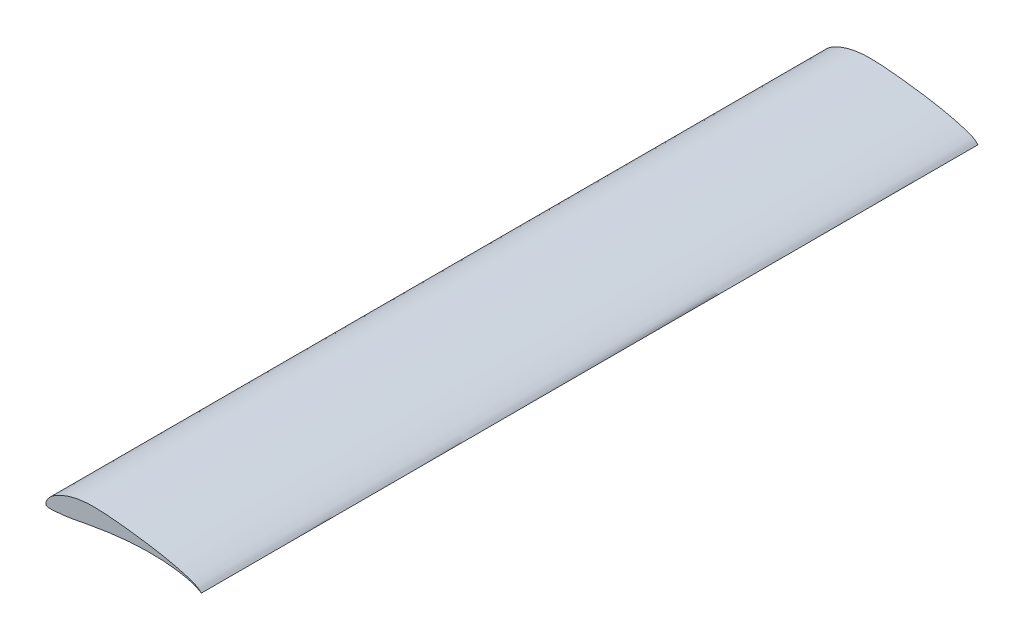
ISO-10303-21;
HEADER;
FILE_DESCRIPTION(('STEP AP214'),'2;1');
FILE_NAME('part.step','',(''),(''),'','','');
FILE_SCHEMA(('AUTOMOTIVE_DESIGN { 1 0 10303 214 1 1 1 1 }'));
ENDSEC;
DATA;
#1=APPLICATION_CONTEXT('core data for automotive mechanical design processes');
#2=APPLICATION_PROTOCOL_DEFINITION('international standard','automotive_design',2000,#1);
#3=PRODUCT_CONTEXT('',#1,'mechanical');
#4=PRODUCT('Part','Part','',(#3));
#5=PRODUCT_RELATED_PRODUCT_CATEGORY('part','',(#4));
#6=PRODUCT_DEFINITION_FORMATION('','',#4);
#7=PRODUCT_DEFINITION_CONTEXT('part definition',#1,'design');
#8=PRODUCT_DEFINITION('design','',#6,#7);
#9=PRODUCT_DEFINITION_SHAPE('','',#8);
#10=(LENGTH_UNIT() NAMED_UNIT(*) SI_UNIT(.MILLI.,.METRE.));
#11=(NAMED_UNIT(*) PLANE_ANGLE_UNIT() SI_UNIT($,.RADIAN.));
#12=(NAMED_UNIT(*) SI_UNIT($,.STERADIAN.) SOLID_ANGLE_UNIT());
#13=UNCERTAINTY_MEASURE_WITH_UNIT(LENGTH_MEASURE(1.E-05),#10,'distance_accuracy_value','');
#14=(GEOMETRIC_REPRESENTATION_CONTEXT(3) GLOBAL_UNCERTAINTY_ASSIGNED_CONTEXT((#13)) GLOBAL_UNIT_ASSIGNED_CONTEXT((#10,
#11,#12)) REPRESENTATION_CONTEXT('',''));
#15=CARTESIAN_POINT('',(0.,0.,0.));
#16=DIRECTION('',(0.,0.,1.));
#17=DIRECTION('',(1.,0.,0.));
#18=AXIS2_PLACEMENT_3D('',#15,#16,#17);
#19=CARTESIAN_POINT('',(190.5,0.,952.5));
#20=CARTESIAN_POINT('',(190.501140449589,0.0048495957089294,952.5));
#21=CARTESIAN_POINT('',(189.874896952706,0.471443657705428,952.5));
#22=CARTESIAN_POINT('',(189.345268773799,0.991100652656051,952.5));
#23=CARTESIAN_POINT('',(188.169280273613,2.0765066228,952.5));
#24=CARTESIAN_POINT('',(186.781888795589,3.23117102655988,952.5));
#25=CARTESIAN_POINT('',(184.88405642052,4.39520121830042,952.5));
#26=CARTESIAN_POINT('',(182.524087437213,5.52327806805247,952.5));
#27=CARTESIAN_POINT('',(179.675049468122,6.70056289760328,952.5));
#28=CARTESIAN_POINT('',(176.341285283456,7.91066310604408,952.5));
#29=CARTESIAN_POINT('',(172.538347888506,9.14503023382941,952.5));
#30=CARTESIAN_POINT('',(168.285979658223,10.3929470321648,952.5));
#31=CARTESIAN_POINT('',(163.607992669297,11.6485563790145,952.5));
#32=CARTESIAN_POINT('',(158.530216744362,12.9003293823792,952.5));
#33=CARTESIAN_POINT('',(153.081764098004,14.1392045174724,952.5));
#34=CARTESIAN_POINT('',(147.295108851122,15.3574437784953,952.5));
#35=CARTESIAN_POINT('',(141.2055870047,16.5487844846756,952.5));
#36=CARTESIAN_POINT('',(134.848789079749,17.6985664854184,952.5));
#37=CARTESIAN_POINT('',(128.264745027978,18.8051470715732,952.5));
#38=CARTESIAN_POINT('',(121.49139921987,19.8542768906775,952.5));
#39=CARTESIAN_POINT('',(114.572555058156,20.8480045739809,952.5));
#40=CARTESIAN_POINT('',(107.552554075075,21.778455325284,952.5));
#41=CARTESIAN_POINT('',(100.482242170247,22.642651753132,952.5));
#42=CARTESIAN_POINT('',(93.418141124453,23.4467128367726,952.5));
#43=CARTESIAN_POINT('',(86.4187311731453,24.1703500382271,952.5));
#44=CARTESIAN_POINT('',(79.5410354374557,24.8000196646809,952.5));
#45=CARTESIAN_POINT('',(72.8334260080536,25.300280470554,952.5));
#46=CARTESIAN_POINT('',(66.3342192129176,25.6443956990042,952.5));
#47=CARTESIAN_POINT('',(60.0795722638279,25.793000688111,952.5));
#48=CARTESIAN_POINT('',(54.1015268277811,25.7771826579008,952.5));
#49=CARTESIAN_POINT('',(48.4112342720622,25.484480074596,952.5));
#50=CARTESIAN_POINT('',(43.0064903328941,24.8913314752254,952.5));
#51=CARTESIAN_POINT('',(37.8652935068441,24.0526105595702,952.5));
#52=CARTESIAN_POINT('',(32.9864029615348,22.9660550175243,952.5));
#53=CARTESIAN_POINT('',(28.374831045459,21.6919170778944,952.5));
#54=CARTESIAN_POINT('',(24.0500898891839,20.2527636743946,952.5));
#55=CARTESIAN_POINT('',(20.0305722180258,18.6822494611587,952.5));
#56=CARTESIAN_POINT('',(16.3412557855691,16.9887886763823,952.5));
#57=CARTESIAN_POINT('',(12.993972054327,15.2067634457409,952.5));
#58=CARTESIAN_POINT('',(10.0069313476093,13.3564388384793,952.5));
#59=CARTESIAN_POINT('',(7.39886570646804,11.4628883578561,952.5));
#60=CARTESIAN_POINT('',(5.17085121626949,9.56624809789992,952.5));
#61=CARTESIAN_POINT('',(3.35519800172101,7.64581480485506,952.5));
#62=CARTESIAN_POINT('',(1.9605447426959,5.71821947228835,952.5));
#63=CARTESIAN_POINT('',(0.930349505974305,3.84292592213187,952.5));
#64=CARTESIAN_POINT('',(0.270103382985031,2.06242354471595,952.5));
#65=CARTESIAN_POINT('',(-0.0445039266248067,0.419020388939446,952.5));
#66=CARTESIAN_POINT('',(0.01622379836538,-0.970909150629432,952.5));
#67=CARTESIAN_POINT('',(0.37406657775095,-2.24569850572259,952.5));
#68=CARTESIAN_POINT('',(1.70422548850311,-2.87851328047877,952.5));
#69=CARTESIAN_POINT('',(3.49264160988838,-2.9672952003997,952.5));
#70=CARTESIAN_POINT('',(5.9391881962373,-3.0533429863419,952.5));
#71=CARTESIAN_POINT('',(9.01589319503747,-2.92066900631582,952.5));
#72=CARTESIAN_POINT('',(12.6879837622343,-2.67685466301448,952.5));
#73=CARTESIAN_POINT('',(16.9145933629107,-2.28631695509474,952.5));
#74=CARTESIAN_POINT('',(21.6524720680806,-1.75790264475743,952.5));
#75=CARTESIAN_POINT('',(26.8785167362475,-1.08027291413276,952.5));
#76=CARTESIAN_POINT('',(32.5901734764809,-0.133184537470371,952.5));
#77=CARTESIAN_POINT('',(38.8152518554393,1.05444893486645,952.5));
#78=CARTESIAN_POINT('',(45.5848730747557,2.34697313689791,952.5));
#79=CARTESIAN_POINT('',(52.8659477782625,3.7116933895576,952.5));
#80=CARTESIAN_POINT('',(60.6127431591076,5.09196451135422,952.5));
#81=CARTESIAN_POINT('',(68.7683664747485,6.43598654583158,952.5));
#82=CARTESIAN_POINT('',(77.2695458328151,7.69887908019521,952.5));
#83=CARTESIAN_POINT('',(86.0430184615308,8.83431467366265,952.5));
#84=CARTESIAN_POINT('',(95.0098869783615,9.8092321815838,952.5));
#85=CARTESIAN_POINT('',(104.085447690544,10.5798643290774,952.5));
#86=CARTESIAN_POINT('',(113.178625109717,11.1261474986054,952.5));
#87=CARTESIAN_POINT('',(122.194418873725,11.426469615573,952.5));
#88=CARTESIAN_POINT('',(131.035023441319,11.464402450769,952.5));
#89=CARTESIAN_POINT('',(139.601808022583,11.2373686451341,952.5));
#90=CARTESIAN_POINT('',(147.796677859016,10.7506831042987,952.5));
#91=CARTESIAN_POINT('',(155.52109080117,10.0106253823236,952.5));
#92=CARTESIAN_POINT('',(162.683083088023,9.04560251163728,952.5));
#93=CARTESIAN_POINT('',(169.189407873441,7.88361581848485,952.5));
#94=CARTESIAN_POINT('',(174.963781380328,6.56358167721512,952.5));
#95=CARTESIAN_POINT('',(179.899784557374,5.15108633861004,952.5));
#96=CARTESIAN_POINT('',(183.93939411068,3.64354937207193,952.5));
#97=CARTESIAN_POINT('',(186.821551541537,2.26396004471716,952.5));
#98=CARTESIAN_POINT('',(188.946489274077,0.988345413219949,952.5));
#99=CARTESIAN_POINT('',(189.762798975449,0.494703593902953,952.5));
#100=CARTESIAN_POINT('',(190.498836365174,-0.0049481875512409,952.5));
#101=CARTESIAN_POINT('',(190.5,0.,952.5));
#102=B_SPLINE_CURVE_WITH_KNOTS('',3,(#19,#20,#21,#22,#23,#24,#25,#26,#27,#28,#29,#30,#31,#32,
#33,#34,#35,#36,#37,#38,#39,#40,#41,#42,#43,#44,#45,#46,#47,#48,#49,#50,#51,#52,#53,#54,#55,#56,
#57,#58,#59,#60,#61,#62,#63,#64,#65,#66,#67,#68,#69,#70,#71,#72,#73,#74,#75,#76,#77,#78,#79,#80,
#81,#82,#83,#84,#85,#86,#87,#88,#89,#90,#91,#92,#93,#94,#95,#96,#97,#98,#99,#100,#101),
.UNSPECIFIED.,.T.,.F.,(4,1,1,1,1,1,1,1,1,1,1,1,1,1,1,1,1,1,1,1,1,1,1,1,1,1,1,1,1,1,1,1,1,1,1,1,
1,1,1,1,1,1,1,1,1,1,1,1,1,1,1,1,1,1,1,1,1,1,1,1,1,1,1,1,1,1,1,1,1,1,1,1,1,1,1,1,1,1,1,1,4),(0.,
0.000979677557134186,0.0036488621677631,0.00748349851947816,0.0120952771855934,
0.0175255907768788,0.024051779993871,0.0317830505527586,0.0406778280832619,0.050710300790478,
0.0618332290621795,0.0739892504845854,0.0871181731906812,0.101145048769791,0.115990637111827,
0.131570421640589,0.147788379302961,0.164550916882416,0.181757895150531,0.199311954944345,
0.217095071712264,0.234990228463986,0.252856883122009,0.270540593729571,0.287886779266045,
0.304773437599674,0.321101419214061,0.336806063174811,0.351800032584037,0.366031063392081,
0.379615674919835,0.392652962879186,0.405170358707495,0.417171919049936,0.428603516911185,
0.439418959108259,0.449596586064162,0.459102079103161,0.467907877534646,0.475988300736527,
0.483308968746149,0.489874507816402,0.495803249719207,0.501149411695552,0.50590307325604,
0.510046768536663,0.513579310681042,0.516446926626751,0.5193500525909,0.523823355179486,
0.529973793997694,0.537715654387927,0.546967844488146,0.55763736682571,0.569620481096633,
0.582804124215616,0.597246960791632,0.613135036654701,0.630443600329816,0.649056123608545,
0.668822256795696,0.689594964002684,0.711189650864602,0.733426688964389,0.756094117504156,
0.778988553684861,0.801889682684955,0.824566597829707,0.846792284880411,0.868338290507787,
0.888978162959066,0.908492011340558,0.926658767581933,0.943286193042322,0.958169210358794,
0.971135821634751,0.981955623079976,0.990251791025976,0.995852565249962,0.999000405686701,1.),.UNSPECIFIED.);
#103=DIRECTION('',(0.,0.,-1.));
#104=VECTOR('',#103,1.);
#105=SURFACE_OF_LINEAR_EXTRUSION('',#102,#104);
#106=CARTESIAN_POINT('',(190.5,0.,952.5));
#107=VERTEX_POINT('',#106);
#108=EDGE_CURVE('E10',#107,#107,#102,.T.);
#109=ORIENTED_EDGE('',*,*,#108,.F.);
#110=EDGE_LOOP('',(#109));
#111=FACE_BOUND('',#110,.T.);
#112=CARTESIAN_POINT('',(190.5,0.,0.));
#113=CARTESIAN_POINT('',(190.501140449589,0.0048495957089294,0.));
#114=CARTESIAN_POINT('',(189.874896952706,0.471443657705428,0.));
#115=CARTESIAN_POINT('',(189.345268773799,0.991100652656051,0.));
#116=CARTESIAN_POINT('',(188.169280273613,2.0765066228,0.));
#117=CARTESIAN_POINT('',(186.781888795589,3.23117102655988,0.));
#118=CARTESIAN_POINT('',(184.88405642052,4.39520121830042,0.));
#119=CARTESIAN_POINT('',(182.524087437213,5.52327806805247,0.));
#120=CARTESIAN_POINT('',(179.675049468122,6.70056289760328,0.));
#121=CARTESIAN_POINT('',(176.341285283456,7.91066310604408,0.));
#122=CARTESIAN_POINT('',(172.538347888506,9.14503023382941,0.));
#123=CARTESIAN_POINT('',(168.285979658223,10.3929470321648,0.));
#124=CARTESIAN_POINT('',(163.607992669297,11.6485563790145,0.));
#125=CARTESIAN_POINT('',(158.530216744362,12.9003293823792,0.));
#126=CARTESIAN_POINT('',(153.081764098004,14.1392045174724,0.));
#127=CARTESIAN_POINT('',(147.295108851122,15.3574437784953,0.));
#128=CARTESIAN_POINT('',(141.2055870047,16.5487844846756,0.));
#129=CARTESIAN_POINT('',(134.848789079749,17.6985664854184,0.));
#130=CARTESIAN_POINT('',(128.264745027978,18.8051470715732,0.));
#131=CARTESIAN_POINT('',(121.49139921987,19.8542768906775,0.));
#132=CARTESIAN_POINT('',(114.572555058156,20.8480045739809,0.));
#133=CARTESIAN_POINT('',(107.552554075075,21.778455325284,0.));
#134=CARTESIAN_POINT('',(100.482242170247,22.642651753132,0.));
#135=CARTESIAN_POINT('',(93.418141124453,23.4467128367726,0.));
#136=CARTESIAN_POINT('',(86.4187311731453,24.1703500382271,0.));
#137=CARTESIAN_POINT('',(79.5410354374557,24.8000196646809,0.));
#138=CARTESIAN_POINT('',(72.8334260080536,25.300280470554,0.));
#139=CARTESIAN_POINT('',(66.3342192129176,25.6443956990042,0.));
#140=CARTESIAN_POINT('',(60.0795722638279,25.793000688111,0.));
#141=CARTESIAN_POINT('',(54.1015268277811,25.7771826579008,0.));
#142=CARTESIAN_POINT('',(48.4112342720622,25.484480074596,0.));
#143=CARTESIAN_POINT('',(43.0064903328941,24.8913314752254,0.));
#144=CARTESIAN_POINT('',(37.8652935068441,24.0526105595702,0.));
#145=CARTESIAN_POINT('',(32.9864029615348,22.9660550175243,0.));
#146=CARTESIAN_POINT('',(28.374831045459,21.6919170778944,0.));
#147=CARTESIAN_POINT('',(24.0500898891839,20.2527636743946,0.));
#148=CARTESIAN_POINT('',(20.0305722180258,18.6822494611587,0.));
#149=CARTESIAN_POINT('',(16.3412557855691,16.9887886763823,0.));
#150=CARTESIAN_POINT('',(12.993972054327,15.2067634457409,0.));
#151=CARTESIAN_POINT('',(10.0069313476093,13.3564388384793,0.));
#152=CARTESIAN_POINT('',(7.39886570646804,11.4628883578561,0.));
#153=CARTESIAN_POINT('',(5.17085121626949,9.56624809789992,0.));
#154=CARTESIAN_POINT('',(3.35519800172101,7.64581480485506,0.));
#155=CARTESIAN_POINT('',(1.9605447426959,5.71821947228835,0.));
#156=CARTESIAN_POINT('',(0.930349505974305,3.84292592213187,0.));
#157=CARTESIAN_POINT('',(0.270103382985031,2.06242354471595,0.));
#158=CARTESIAN_POINT('',(-0.0445039266248067,0.419020388939446,0.));
#159=CARTESIAN_POINT('',(0.01622379836538,-0.970909150629432,0.));
#160=CARTESIAN_POINT('',(0.37406657775095,-2.24569850572259,0.));
#161=CARTESIAN_POINT('',(1.70422548850311,-2.87851328047877,0.));
#162=CARTESIAN_POINT('',(3.49264160988838,-2.9672952003997,0.));
#163=CARTESIAN_POINT('',(5.9391881962373,-3.0533429863419,0.));
#164=CARTESIAN_POINT('',(9.01589319503747,-2.92066900631582,0.));
#165=CARTESIAN_POINT('',(12.6879837622343,-2.67685466301448,0.));
#166=CARTESIAN_POINT('',(16.9145933629107,-2.28631695509474,0.));
#167=CARTESIAN_POINT('',(21.6524720680806,-1.75790264475743,0.));
#168=CARTESIAN_POINT('',(26.8785167362475,-1.08027291413276,0.));
#169=CARTESIAN_POINT('',(32.5901734764809,-0.133184537470371,0.));
#170=CARTESIAN_POINT('',(38.8152518554393,1.05444893486645,0.));
#171=CARTESIAN_POINT('',(45.5848730747557,2.34697313689791,0.));
#172=CARTESIAN_POINT('',(52.8659477782625,3.7116933895576,0.));
#173=CARTESIAN_POINT('',(60.6127431591076,5.09196451135422,0.));
#174=CARTESIAN_POINT('',(68.7683664747485,6.43598654583158,0.));
#175=CARTESIAN_POINT('',(77.2695458328151,7.69887908019521,0.));
#176=CARTESIAN_POINT('',(86.0430184615308,8.83431467366265,0.));
#177=CARTESIAN_POINT('',(95.0098869783615,9.8092321815838,0.));
#178=CARTESIAN_POINT('',(104.085447690544,10.5798643290774,0.));
#179=CARTESIAN_POINT('',(113.178625109717,11.1261474986054,0.));
#180=CARTESIAN_POINT('',(122.194418873725,11.426469615573,0.));
#181=CARTESIAN_POINT('',(131.035023441319,11.464402450769,0.));
#182=CARTESIAN_POINT('',(139.601808022583,11.2373686451341,0.));
#183=CARTESIAN_POINT('',(147.796677859016,10.7506831042987,0.));
#184=CARTESIAN_POINT('',(155.52109080117,10.0106253823236,0.));
#185=CARTESIAN_POINT('',(162.683083088023,9.04560251163728,0.));
#186=CARTESIAN_POINT('',(169.189407873441,7.88361581848485,0.));
#187=CARTESIAN_POINT('',(174.963781380328,6.56358167721512,0.));
#188=CARTESIAN_POINT('',(179.899784557374,5.15108633861004,0.));
#189=CARTESIAN_POINT('',(183.93939411068,3.64354937207193,0.));
#190=CARTESIAN_POINT('',(186.821551541537,2.26396004471716,0.));
#191=CARTESIAN_POINT('',(188.946489274077,0.988345413219949,0.));
#192=CARTESIAN_POINT('',(189.762798975449,0.494703593902953,0.));
#193=CARTESIAN_POINT('',(190.498836365174,-0.0049481875512409,0.));
#194=CARTESIAN_POINT('',(190.5,0.,0.));
#195=B_SPLINE_CURVE_WITH_KNOTS('',3,(#112,#113,#114,#115,#116,#117,#118,#119,#120,#121,#122,
#123,#124,#125,#126,#127,#128,#129,#130,#131,#132,#133,#134,#135,#136,#137,#138,#139,#140,#141,
#142,#143,#144,#145,#146,#147,#148,#149,#150,#151,#152,#153,#154,#155,#156,#157,#158,#159,#160,
#161,#162,#163,#164,#165,#166,#167,#168,#169,#170,#171,#172,#173,#174,#175,#176,#177,#178,#179,
#180,#181,#182,#183,#184,#185,#186,#187,#188,#189,#190,#191,#192,#193,#194),.UNSPECIFIED.,.T.,
.F.,(4,1,1,1,1,1,1,1,1,1,1,1,1,1,1,1,1,1,1,1,1,1,1,1,1,1,1,1,1,1,1,1,1,1,1,1,1,1,1,1,1,1,1,1,1,
1,1,1,1,1,1,1,1,1,1,1,1,1,1,1,1,1,1,1,1,1,1,1,1,1,1,1,1,1,1,1,1,1,1,1,4),(0.,
0.000979677557134186,0.0036488621677631,0.00748349851947816,0.0120952771855934,
0.0175255907768788,0.024051779993871,0.0317830505527586,0.0406778280832619,0.050710300790478,
0.0618332290621795,0.0739892504845854,0.0871181731906812,0.101145048769791,0.115990637111827,
0.131570421640589,0.147788379302961,0.164550916882416,0.181757895150531,0.199311954944345,
0.217095071712264,0.234990228463986,0.252856883122009,0.270540593729571,0.287886779266045,
0.304773437599674,0.321101419214061,0.336806063174811,0.351800032584037,0.366031063392081,
0.379615674919835,0.392652962879186,0.405170358707495,0.417171919049936,0.428603516911185,
0.439418959108259,0.449596586064162,0.459102079103161,0.467907877534646,0.475988300736527,
0.483308968746149,0.489874507816402,0.495803249719207,0.501149411695552,0.50590307325604,
0.510046768536663,0.513579310681042,0.516446926626751,0.5193500525909,0.523823355179486,
0.529973793997694,0.537715654387927,0.546967844488146,0.55763736682571,0.569620481096633,
0.582804124215616,0.597246960791632,0.613135036654701,0.630443600329816,0.649056123608545,
0.668822256795696,0.689594964002684,0.711189650864602,0.733426688964389,0.756094117504156,
0.778988553684861,0.801889682684955,0.824566597829707,0.846792284880411,0.868338290507787,
0.888978162959066,0.908492011340558,0.926658767581933,0.943286193042322,0.958169210358794,
0.971135821634751,0.981955623079976,0.990251791025976,0.995852565249962,0.999000405686701,1.),.UNSPECIFIED.);
#196=CARTESIAN_POINT('',(190.5,0.,0.));
#197=VERTEX_POINT('',#196);
#198=EDGE_CURVE('E34',#197,#197,#195,.T.);
#199=ORIENTED_EDGE('',*,*,#198,.T.);
#200=EDGE_LOOP('',(#199));
#201=FACE_BOUND('',#200,.T.);
#202=ADVANCED_FACE('F30',(#111,#201),#105,.F.);
#203=CARTESIAN_POINT('',(1.13877382792317,4.16585107360259,952.5));
#204=DIRECTION('',(0.,0.,-1.));
#205=DIRECTION('',(-1.,0.,0.));
#206=AXIS2_PLACEMENT_3D('',#203,#204,#205);
#207=PLANE('',#206);
#208=ORIENTED_EDGE('',*,*,#108,.T.);
#209=EDGE_LOOP('',(#208));
#210=FACE_BOUND('',#209,.T.);
#211=ADVANCED_FACE('F53',(#210),#207,.F.);
#212=CARTESIAN_POINT('',(1.13877382792317,4.16585107360259,0.));
#213=DIRECTION('',(0.,0.,-1.));
#214=DIRECTION('',(-1.,0.,0.));
#215=AXIS2_PLACEMENT_3D('',#212,#213,#214);
#216=PLANE('',#215);
#217=ORIENTED_EDGE('',*,*,#198,.F.);
#218=EDGE_LOOP('',(#217));
#219=FACE_BOUND('',#218,.T.);
#220=ADVANCED_FACE('F51',(#219),#216,.T.);
#221=CLOSED_SHELL('',(#202,#211,#220));
#222=MANIFOLD_SOLID_BREP('B2',#221);
#223=ADVANCED_BREP_SHAPE_REPRESENTATION('',(#18,#222),#14);
#224=SHAPE_DEFINITION_REPRESENTATION(#9,#223);
ENDSEC;
END-ISO-10303-21;
